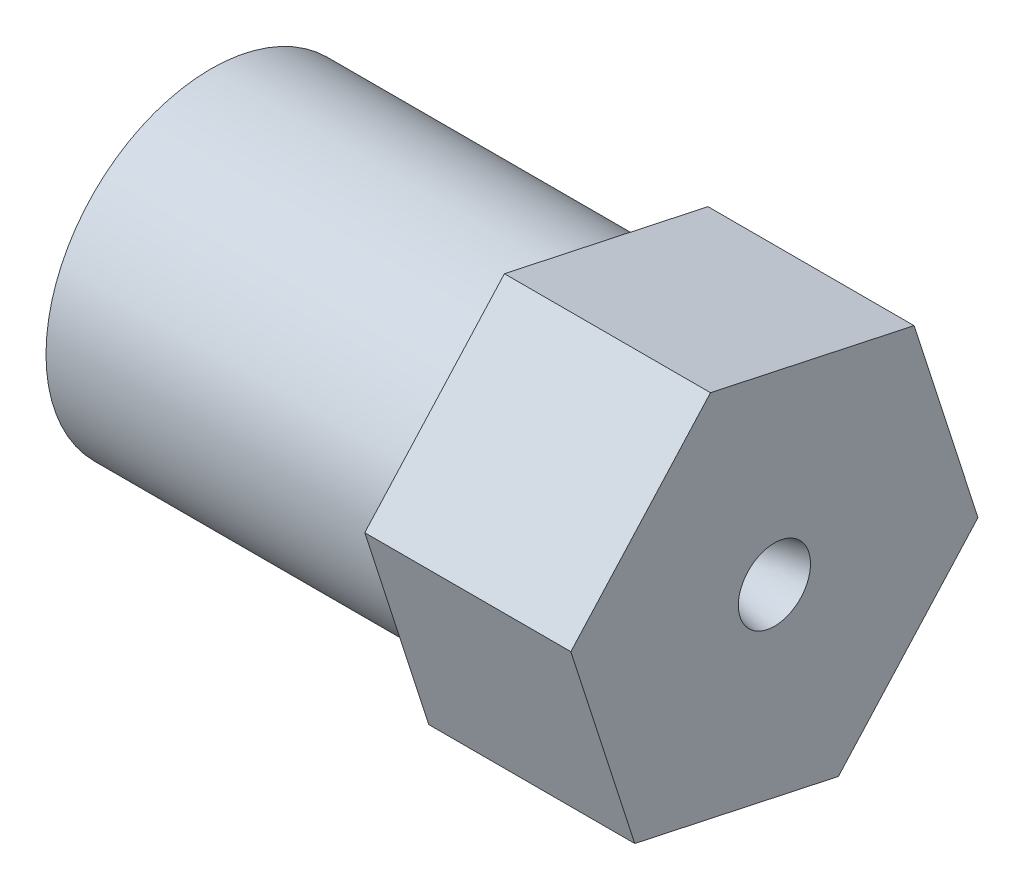
ISO-10303-21;
HEADER;
FILE_DESCRIPTION(('STEP AP214'),'2;1');
FILE_NAME('part.step','',(''),(''),'','','');
FILE_SCHEMA(('AUTOMOTIVE_DESIGN { 1 0 10303 214 1 1 1 1 }'));
ENDSEC;
DATA;
#1=APPLICATION_CONTEXT('core data for automotive mechanical design processes');
#2=APPLICATION_PROTOCOL_DEFINITION('international standard','automotive_design',2000,#1);
#3=PRODUCT_CONTEXT('',#1,'mechanical');
#4=PRODUCT('Part','Part','',(#3));
#5=PRODUCT_RELATED_PRODUCT_CATEGORY('part','',(#4));
#6=PRODUCT_DEFINITION_FORMATION('','',#4);
#7=PRODUCT_DEFINITION_CONTEXT('part definition',#1,'design');
#8=PRODUCT_DEFINITION('design','',#6,#7);
#9=PRODUCT_DEFINITION_SHAPE('','',#8);
#10=(LENGTH_UNIT() NAMED_UNIT(*) SI_UNIT(.MILLI.,.METRE.));
#11=(NAMED_UNIT(*) PLANE_ANGLE_UNIT() SI_UNIT($,.RADIAN.));
#12=(NAMED_UNIT(*) SI_UNIT($,.STERADIAN.) SOLID_ANGLE_UNIT());
#13=UNCERTAINTY_MEASURE_WITH_UNIT(LENGTH_MEASURE(1.E-05),#10,'distance_accuracy_value','');
#14=(GEOMETRIC_REPRESENTATION_CONTEXT(3) GLOBAL_UNCERTAINTY_ASSIGNED_CONTEXT((#13)) GLOBAL_UNIT_ASSIGNED_CONTEXT((#10,
#11,#12)) REPRESENTATION_CONTEXT('',''));
#15=CARTESIAN_POINT('',(0.,0.,0.));
#16=DIRECTION('',(0.,0.,1.));
#17=DIRECTION('',(1.,0.,0.));
#18=AXIS2_PLACEMENT_3D('',#15,#16,#17);
#19=CARTESIAN_POINT('',(0.,0.,0.));
#20=DIRECTION('',(-1.,0.,0.));
#21=DIRECTION('',(0.,0.,1.));
#22=AXIS2_PLACEMENT_3D('',#19,#20,#21);
#23=CYLINDRICAL_SURFACE('',#22,10.16);
#24=CARTESIAN_POINT('',(-10.3539366308657,0.,0.));
#25=DIRECTION('',(1.,0.,0.));
#26=DIRECTION('',(0.,0.,-1.));
#27=AXIS2_PLACEMENT_3D('',#24,#25,#26);
#28=CIRCLE('',#27,10.16);
#29=CARTESIAN_POINT('',(-10.3539366308657,0.,-10.16));
#30=VERTEX_POINT('',#29);
#31=EDGE_CURVE('E11',#30,#30,#28,.F.);
#32=ORIENTED_EDGE('',*,*,#31,.T.);
#33=EDGE_LOOP('',(#32));
#34=FACE_BOUND('',#33,.T.);
#35=CARTESIAN_POINT('',(-31.75,0.,0.));
#36=DIRECTION('',(-1.,0.,0.));
#37=DIRECTION('',(0.,0.,1.));
#38=AXIS2_PLACEMENT_3D('',#35,#36,#37);
#39=CIRCLE('',#38,10.16);
#40=CARTESIAN_POINT('',(-31.75,0.,10.16));
#41=VERTEX_POINT('',#40);
#42=EDGE_CURVE('E225',#41,#41,#39,.T.);
#43=ORIENTED_EDGE('',*,*,#42,.F.);
#44=EDGE_LOOP('',(#43));
#45=FACE_BOUND('',#44,.T.);
#46=ADVANCED_FACE('F37',(#34,#45),#23,.T.);
#47=CARTESIAN_POINT('',(0.,0.,0.));
#48=DIRECTION('',(-1.,0.,0.));
#49=DIRECTION('',(0.,0.,1.));
#50=AXIS2_PLACEMENT_3D('',#47,#48,#49);
#51=TOROIDAL_SURFACE('',#50,3.75,2.25);
#52=CARTESIAN_POINT('',(0.,0.,0.));
#53=DIRECTION('',(-1.,0.,0.));
#54=DIRECTION('',(0.,0.,1.));
#55=AXIS2_PLACEMENT_3D('',#52,#53,#54);
#56=CIRCLE('',#55,1.49999999991984);
#57=CARTESIAN_POINT('',(0.,0.,1.49999999991984));
#58=VERTEX_POINT('',#57);
#59=EDGE_CURVE('E177',#58,#58,#56,.T.);
#60=ORIENTED_EDGE('',*,*,#59,.F.);
#61=EDGE_LOOP('',(#60));
#62=FACE_BOUND('',#61,.T.);
#63=CARTESIAN_POINT('',(-1.59099025766971,0.,0.));
#64=DIRECTION('',(-1.,0.,0.));
#65=DIRECTION('',(0.,0.,1.));
#66=AXIS2_PLACEMENT_3D('',#63,#64,#65);
#67=CIRCLE('',#66,2.15900974233025);
#68=CARTESIAN_POINT('',(-1.59099025766971,0.,2.15900974233025));
#69=VERTEX_POINT('',#68);
#70=EDGE_CURVE('E142',#69,#69,#67,.T.);
#71=ORIENTED_EDGE('',*,*,#70,.T.);
#72=EDGE_LOOP('',(#71));
#73=FACE_BOUND('',#72,.T.);
#74=ADVANCED_FACE('F166',(#62,#73),#51,.T.);
#75=CARTESIAN_POINT('',(0.,0.,0.));
#76=DIRECTION('',(-1.,0.,0.));
#77=DIRECTION('',(0.,0.,1.));
#78=AXIS2_PLACEMENT_3D('',#75,#76,#77);
#79=TOROIDAL_SURFACE('',#78,2.1,0.600000000080161);
#80=CARTESIAN_POINT('',(0.205212085985895,0.,0.));
#81=DIRECTION('',(-1.,0.,0.));
#82=DIRECTION('',(0.,0.,1.));
#83=AXIS2_PLACEMENT_3D('',#80,#81,#82);
#84=CIRCLE('',#83,1.53618442721648);
#85=CARTESIAN_POINT('',(0.205212085985895,0.,1.53618442721648));
#86=VERTEX_POINT('',#85);
#87=EDGE_CURVE('E231',#86,#86,#84,.T.);
#88=ORIENTED_EDGE('',*,*,#87,.F.);
#89=EDGE_LOOP('',(#88));
#90=FACE_BOUND('',#89,.T.);
#91=ORIENTED_EDGE('',*,*,#59,.T.);
#92=EDGE_LOOP('',(#91));
#93=FACE_BOUND('',#92,.T.);
#94=ADVANCED_FACE('F162',(#90,#93),#79,.T.);
#95=CARTESIAN_POINT('',(337159.328455915,-941460.351219445,0.));
#96=CARTESIAN_POINT('',(-342019.938114273,939694.156970084,0.));
#97=CARTESIAN_POINT('',(346881.368620976,-937921.817983014,0.));
#98=B_SPLINE_CURVE_WITH_KNOTS('',2,(#95,#96,#97),.UNSPECIFIED.,.F.,.F.,(3,3),(0.,1.),.UNSPECIFIED.);
#99=CARTESIAN_POINT('',(0.,0.,0.));
#100=DIRECTION('',(-1.,0.,0.));
#101=AXIS1_PLACEMENT('',#99,#100);
#102=SURFACE_OF_REVOLUTION('',#98,#101);
#103=CARTESIAN_POINT('',(2.98106336913434,0.,0.));
#104=DIRECTION('',(-1.,0.,0.));
#105=DIRECTION('',(0.,0.,1.));
#106=AXIS2_PLACEMENT_3D('',#103,#104,#105);
#107=CIRCLE('',#106,2.2248595461287);
#108=CARTESIAN_POINT('',(2.98106336913434,0.,2.2248595461287));
#109=VERTEX_POINT('',#108);
#110=EDGE_CURVE('E228',#109,#109,#107,.T.);
#111=ORIENTED_EDGE('',*,*,#110,.F.);
#112=EDGE_LOOP('',(#111));
#113=FACE_BOUND('',#112,.T.);
#114=ORIENTED_EDGE('',*,*,#87,.T.);
#115=EDGE_LOOP('',(#114));
#116=FACE_BOUND('',#115,.T.);
#117=ADVANCED_FACE('F157',(#113,#116),#102,.T.);
#118=CARTESIAN_POINT('',(2.98106336913434,10.16,0.));
#119=DIRECTION('',(-1.,0.,0.));
#120=DIRECTION('',(0.,0.,1.));
#121=AXIS2_PLACEMENT_3D('',#118,#119,#120);
#122=PLANE('',#121);
#123=ORIENTED_EDGE('',*,*,#110,.T.);
#124=EDGE_LOOP('',(#123));
#125=FACE_BOUND('',#124,.T.);
#126=DIRECTION('',(0.,-0.951681663898051,-0.307086324345838));
#127=VECTOR('',#126,1.);
#128=CARTESIAN_POINT('',(2.98106336913434,-3.41249677929312,10.5755624900671));
#129=LINE('',#128,#127);
#130=CARTESIAN_POINT('',(2.98106336913434,2.69330707117882,12.5457684242007));
#131=VERTEX_POINT('',#130);
#132=CARTESIAN_POINT('',(2.98106336913434,-9.51830062976507,8.60535655593348));
#133=VERTEX_POINT('',#132);
#134=EDGE_CURVE('E125',#131,#133,#129,.T.);
#135=ORIENTED_EDGE('',*,*,#134,.T.);
#136=DIRECTION('',(0.,-0.209896273910742,-0.977723659424475));
#137=VECTOR('',#136,1.);
#138=CARTESIAN_POINT('',(2.98106336913434,-10.8649541653545,2.33247234383312));
#139=LINE('',#138,#137);
#140=CARTESIAN_POINT('',(2.98106336913434,-12.2116077009439,-3.94041186826723));
#141=VERTEX_POINT('',#140);
#142=EDGE_CURVE('E128',#133,#141,#139,.T.);
#143=ORIENTED_EDGE('',*,*,#142,.T.);
#144=DIRECTION('',(0.,0.741785389987309,-0.670637335078637));
#145=VECTOR('',#144,1.);
#146=CARTESIAN_POINT('',(2.98106336913434,-7.45245738606136,-8.24309014623397));
#147=LINE('',#146,#145);
#148=CARTESIAN_POINT('',(2.98106336913434,-2.69330707117882,-12.5457684242007));
#149=VERTEX_POINT('',#148);
#150=EDGE_CURVE('E131',#141,#149,#147,.T.);
#151=ORIENTED_EDGE('',*,*,#150,.T.);
#152=DIRECTION('',(0.,0.951681663898051,0.307086324345838));
#153=VECTOR('',#152,1.);
#154=CARTESIAN_POINT('',(2.98106336913434,3.41249677929312,-10.5755624900671));
#155=LINE('',#154,#153);
#156=CARTESIAN_POINT('',(2.98106336913434,9.51830062976506,-8.60535655593348));
#157=VERTEX_POINT('',#156);
#158=EDGE_CURVE('E134',#149,#157,#155,.T.);
#159=ORIENTED_EDGE('',*,*,#158,.T.);
#160=DIRECTION('',(0.,0.209896273910742,0.977723659424475));
#161=VECTOR('',#160,1.);
#162=CARTESIAN_POINT('',(2.98106336913434,10.8649541653545,-2.33247234383312));
#163=LINE('',#162,#161);
#164=CARTESIAN_POINT('',(2.98106336913434,12.2116077009439,3.94041186826724));
#165=VERTEX_POINT('',#164);
#166=EDGE_CURVE('E102',#157,#165,#163,.T.);
#167=ORIENTED_EDGE('',*,*,#166,.T.);
#168=DIRECTION('',(0.,-0.741785389987309,0.670637335078637));
#169=VECTOR('',#168,1.);
#170=CARTESIAN_POINT('',(2.98106336913434,7.45245738606136,8.24309014623397));
#171=LINE('',#170,#169);
#172=EDGE_CURVE('E137',#165,#131,#171,.T.);
#173=ORIENTED_EDGE('',*,*,#172,.T.);
#174=EDGE_LOOP('',(#135,#143,#151,#159,#167,#173));
#175=FACE_BOUND('',#174,.T.);
#176=ADVANCED_FACE('F161',(#125,#175),#122,.F.);
#177=CARTESIAN_POINT('',(-31.75,10.16,0.));
#178=DIRECTION('',(1.,0.,0.));
#179=DIRECTION('',(0.,0.,-1.));
#180=AXIS2_PLACEMENT_3D('',#177,#178,#179);
#181=PLANE('',#180);
#182=CARTESIAN_POINT('',(-31.75,0.,0.));
#183=DIRECTION('',(-1.,0.,0.));
#184=DIRECTION('',(0.,0.,1.));
#185=AXIS2_PLACEMENT_3D('',#182,#183,#184);
#186=CIRCLE('',#185,8.6614);
#187=CARTESIAN_POINT('',(-31.75,0.,8.6614));
#188=VERTEX_POINT('',#187);
#189=EDGE_CURVE('E222',#188,#188,#186,.T.);
#190=ORIENTED_EDGE('',*,*,#189,.F.);
#191=EDGE_LOOP('',(#190));
#192=FACE_BOUND('',#191,.T.);
#193=ORIENTED_EDGE('',*,*,#42,.T.);
#194=EDGE_LOOP('',(#193));
#195=FACE_BOUND('',#194,.T.);
#196=ADVANCED_FACE('F249',(#192,#195),#181,.F.);
#197=CARTESIAN_POINT('',(-31.115,0.,0.));
#198=DIRECTION('',(-1.,0.,0.));
#199=DIRECTION('',(0.,0.,1.));
#200=AXIS2_PLACEMENT_3D('',#197,#198,#199);
#201=TOROIDAL_SURFACE('',#200,8.6614,0.635);
#202=CARTESIAN_POINT('',(-31.115,0.,0.));
#203=DIRECTION('',(-1.,0.,0.));
#204=DIRECTION('',(0.,0.,1.));
#205=AXIS2_PLACEMENT_3D('',#202,#203,#204);
#206=CIRCLE('',#205,8.02639999999999);
#207=CARTESIAN_POINT('',(-31.115,0.,8.02639999999999));
#208=VERTEX_POINT('',#207);
#209=EDGE_CURVE('E219',#208,#208,#206,.T.);
#210=ORIENTED_EDGE('',*,*,#209,.F.);
#211=EDGE_LOOP('',(#210));
#212=FACE_BOUND('',#211,.T.);
#213=ORIENTED_EDGE('',*,*,#189,.T.);
#214=EDGE_LOOP('',(#213));
#215=FACE_BOUND('',#214,.T.);
#216=ADVANCED_FACE('F251',(#212,#215),#201,.T.);
#217=CARTESIAN_POINT('',(0.,0.,0.));
#218=DIRECTION('',(-1.,0.,0.));
#219=DIRECTION('',(0.,0.,1.));
#220=AXIS2_PLACEMENT_3D('',#217,#218,#219);
#221=CYLINDRICAL_SURFACE('',#220,8.02639999999999);
#222=CARTESIAN_POINT('',(-25.019,0.,0.));
#223=DIRECTION('',(-1.,0.,0.));
#224=DIRECTION('',(0.,0.,1.));
#225=AXIS2_PLACEMENT_3D('',#222,#223,#224);
#226=CIRCLE('',#225,8.02639999999999);
#227=CARTESIAN_POINT('',(-25.019,0.,8.02639999999999));
#228=VERTEX_POINT('',#227);
#229=EDGE_CURVE('E216',#228,#228,#226,.T.);
#230=ORIENTED_EDGE('',*,*,#229,.F.);
#231=EDGE_LOOP('',(#230));
#232=FACE_BOUND('',#231,.T.);
#233=ORIENTED_EDGE('',*,*,#209,.T.);
#234=EDGE_LOOP('',(#233));
#235=FACE_BOUND('',#234,.T.);
#236=ADVANCED_FACE('F258',(#232,#235),#221,.F.);
#237=CARTESIAN_POINT('',(-25.019,0.,0.));
#238=DIRECTION('',(-1.,0.,0.));
#239=DIRECTION('',(0.,0.,1.));
#240=AXIS2_PLACEMENT_3D('',#237,#238,#239);
#241=TOROIDAL_SURFACE('',#240,7.89939999999999,0.127);
#242=CARTESIAN_POINT('',(-24.892,0.,0.));
#243=DIRECTION('',(-1.,0.,0.));
#244=DIRECTION('',(0.,0.,1.));
#245=AXIS2_PLACEMENT_3D('',#242,#243,#244);
#246=CIRCLE('',#245,7.89939999999999);
#247=CARTESIAN_POINT('',(-24.892,0.,7.89939999999999));
#248=VERTEX_POINT('',#247);
#249=EDGE_CURVE('E213',#248,#248,#246,.T.);
#250=ORIENTED_EDGE('',*,*,#249,.F.);
#251=EDGE_LOOP('',(#250));
#252=FACE_BOUND('',#251,.T.);
#253=ORIENTED_EDGE('',*,*,#229,.T.);
#254=EDGE_LOOP('',(#253));
#255=FACE_BOUND('',#254,.T.);
#256=ADVANCED_FACE('F266',(#252,#255),#241,.F.);
#257=CARTESIAN_POINT('',(-24.892,6.9469,0.));
#258=DIRECTION('',(1.,0.,0.));
#259=DIRECTION('',(0.,0.,-1.));
#260=AXIS2_PLACEMENT_3D('',#257,#258,#259);
#261=PLANE('',#260);
#262=CARTESIAN_POINT('',(-24.892,0.,0.));
#263=DIRECTION('',(-1.,0.,0.));
#264=DIRECTION('',(0.,0.,1.));
#265=AXIS2_PLACEMENT_3D('',#262,#263,#264);
#266=CIRCLE('',#265,6.9469);
#267=CARTESIAN_POINT('',(-24.892,0.,6.9469));
#268=VERTEX_POINT('',#267);
#269=EDGE_CURVE('E210',#268,#268,#266,.T.);
#270=ORIENTED_EDGE('',*,*,#269,.F.);
#271=EDGE_LOOP('',(#270));
#272=FACE_BOUND('',#271,.T.);
#273=ORIENTED_EDGE('',*,*,#249,.T.);
#274=EDGE_LOOP('',(#273));
#275=FACE_BOUND('',#274,.T.);
#276=ADVANCED_FACE('F270',(#272,#275),#261,.F.);
#277=CARTESIAN_POINT('',(0.,0.,0.));
#278=DIRECTION('',(-1.,0.,0.));
#279=DIRECTION('',(0.,0.,1.));
#280=AXIS2_PLACEMENT_3D('',#277,#278,#279);
#281=CYLINDRICAL_SURFACE('',#280,6.9469);
#282=CARTESIAN_POINT('',(-20.066,0.,0.));
#283=DIRECTION('',(-1.,0.,0.));
#284=DIRECTION('',(0.,0.,1.));
#285=AXIS2_PLACEMENT_3D('',#282,#283,#284);
#286=CIRCLE('',#285,6.9469);
#287=CARTESIAN_POINT('',(-20.066,0.,6.9469));
#288=VERTEX_POINT('',#287);
#289=EDGE_CURVE('E207',#288,#288,#286,.T.);
#290=ORIENTED_EDGE('',*,*,#289,.F.);
#291=EDGE_LOOP('',(#290));
#292=FACE_BOUND('',#291,.T.);
#293=ORIENTED_EDGE('',*,*,#269,.T.);
#294=EDGE_LOOP('',(#293));
#295=FACE_BOUND('',#294,.T.);
#296=ADVANCED_FACE('F274',(#292,#295),#281,.F.);
#297=CARTESIAN_POINT('',(-20.066,0.,0.));
#298=DIRECTION('',(-1.,0.,0.));
#299=DIRECTION('',(0.,0.,1.));
#300=AXIS2_PLACEMENT_3D('',#297,#298,#299);
#301=TOROIDAL_SURFACE('',#300,6.8199,0.127);
#302=CARTESIAN_POINT('',(-19.939,0.,0.));
#303=DIRECTION('',(-1.,0.,0.));
#304=DIRECTION('',(0.,0.,1.));
#305=AXIS2_PLACEMENT_3D('',#302,#303,#304);
#306=CIRCLE('',#305,6.8199);
#307=CARTESIAN_POINT('',(-19.939,0.,6.8199));
#308=VERTEX_POINT('',#307);
#309=EDGE_CURVE('E204',#308,#308,#306,.T.);
#310=ORIENTED_EDGE('',*,*,#309,.F.);
#311=EDGE_LOOP('',(#310));
#312=FACE_BOUND('',#311,.T.);
#313=ORIENTED_EDGE('',*,*,#289,.T.);
#314=EDGE_LOOP('',(#313));
#315=FACE_BOUND('',#314,.T.);
#316=ADVANCED_FACE('F278',(#312,#315),#301,.F.);
#317=CARTESIAN_POINT('',(-19.939,5.46100000000001,0.));
#318=DIRECTION('',(1.,0.,0.));
#319=DIRECTION('',(0.,0.,-1.));
#320=AXIS2_PLACEMENT_3D('',#317,#318,#319);
#321=PLANE('',#320);
#322=CARTESIAN_POINT('',(-19.939,0.,0.));
#323=DIRECTION('',(-1.,0.,0.));
#324=DIRECTION('',(0.,0.,1.));
#325=AXIS2_PLACEMENT_3D('',#322,#323,#324);
#326=CIRCLE('',#325,5.46100000000001);
#327=CARTESIAN_POINT('',(-19.939,0.,5.46100000000001));
#328=VERTEX_POINT('',#327);
#329=EDGE_CURVE('E201',#328,#328,#326,.T.);
#330=ORIENTED_EDGE('',*,*,#329,.F.);
#331=EDGE_LOOP('',(#330));
#332=FACE_BOUND('',#331,.T.);
#333=ORIENTED_EDGE('',*,*,#309,.T.);
#334=EDGE_LOOP('',(#333));
#335=FACE_BOUND('',#334,.T.);
#336=ADVANCED_FACE('F282',(#332,#335),#321,.F.);
#337=CARTESIAN_POINT('',(-19.304,0.,0.));
#338=DIRECTION('',(-1.,0.,0.));
#339=DIRECTION('',(0.,0.,1.));
#340=AXIS2_PLACEMENT_3D('',#337,#338,#339);
#341=TOROIDAL_SURFACE('',#340,5.461,0.635);
#342=CARTESIAN_POINT('',(-19.304,0.,0.));
#343=DIRECTION('',(-1.,0.,0.));
#344=DIRECTION('',(0.,0.,1.));
#345=AXIS2_PLACEMENT_3D('',#342,#343,#344);
#346=CIRCLE('',#345,4.826);
#347=CARTESIAN_POINT('',(-19.304,0.,4.826));
#348=VERTEX_POINT('',#347);
#349=EDGE_CURVE('E198',#348,#348,#346,.T.);
#350=ORIENTED_EDGE('',*,*,#349,.F.);
#351=EDGE_LOOP('',(#350));
#352=FACE_BOUND('',#351,.T.);
#353=ORIENTED_EDGE('',*,*,#329,.T.);
#354=EDGE_LOOP('',(#353));
#355=FACE_BOUND('',#354,.T.);
#356=ADVANCED_FACE('F286',(#352,#355),#341,.T.);
#357=CARTESIAN_POINT('',(0.,0.,0.));
#358=DIRECTION('',(-1.,0.,0.));
#359=DIRECTION('',(0.,0.,1.));
#360=AXIS2_PLACEMENT_3D('',#357,#358,#359);
#361=CYLINDRICAL_SURFACE('',#360,4.826);
#362=CARTESIAN_POINT('',(-13.589,0.,0.));
#363=DIRECTION('',(-1.,0.,0.));
#364=DIRECTION('',(0.,0.,1.));
#365=AXIS2_PLACEMENT_3D('',#362,#363,#364);
#366=CIRCLE('',#365,4.826);
#367=CARTESIAN_POINT('',(-13.589,0.,4.826));
#368=VERTEX_POINT('',#367);
#369=EDGE_CURVE('E195',#368,#368,#366,.T.);
#370=ORIENTED_EDGE('',*,*,#369,.F.);
#371=EDGE_LOOP('',(#370));
#372=FACE_BOUND('',#371,.T.);
#373=ORIENTED_EDGE('',*,*,#349,.T.);
#374=EDGE_LOOP('',(#373));
#375=FACE_BOUND('',#374,.T.);
#376=ADVANCED_FACE('F290',(#372,#375),#361,.F.);
#377=CARTESIAN_POINT('',(-13.589,0.,0.));
#378=DIRECTION('',(-1.,0.,0.));
#379=DIRECTION('',(0.,0.,1.));
#380=AXIS2_PLACEMENT_3D('',#377,#378,#379);
#381=TOROIDAL_SURFACE('',#380,4.699,0.127);
#382=CARTESIAN_POINT('',(-13.462,0.,0.));
#383=DIRECTION('',(-1.,0.,0.));
#384=DIRECTION('',(0.,0.,1.));
#385=AXIS2_PLACEMENT_3D('',#382,#383,#384);
#386=CIRCLE('',#385,4.699);
#387=CARTESIAN_POINT('',(-13.462,0.,4.699));
#388=VERTEX_POINT('',#387);
#389=EDGE_CURVE('E192',#388,#388,#386,.T.);
#390=ORIENTED_EDGE('',*,*,#389,.F.);
#391=EDGE_LOOP('',(#390));
#392=FACE_BOUND('',#391,.T.);
#393=ORIENTED_EDGE('',*,*,#369,.T.);
#394=EDGE_LOOP('',(#393));
#395=FACE_BOUND('',#394,.T.);
#396=ADVANCED_FACE('F294',(#392,#395),#381,.F.);
#397=CARTESIAN_POINT('',(-13.462,4.445,0.));
#398=DIRECTION('',(1.,0.,0.));
#399=DIRECTION('',(0.,0.,-1.));
#400=AXIS2_PLACEMENT_3D('',#397,#398,#399);
#401=PLANE('',#400);
#402=CARTESIAN_POINT('',(-13.462,0.,0.));
#403=DIRECTION('',(-1.,0.,0.));
#404=DIRECTION('',(0.,0.,1.));
#405=AXIS2_PLACEMENT_3D('',#402,#403,#404);
#406=CIRCLE('',#405,4.445);
#407=CARTESIAN_POINT('',(-13.462,0.,4.445));
#408=VERTEX_POINT('',#407);
#409=EDGE_CURVE('E187',#408,#408,#406,.T.);
#410=ORIENTED_EDGE('',*,*,#409,.F.);
#411=EDGE_LOOP('',(#410));
#412=FACE_BOUND('',#411,.T.);
#413=ORIENTED_EDGE('',*,*,#389,.T.);
#414=EDGE_LOOP('',(#413));
#415=FACE_BOUND('',#414,.T.);
#416=ADVANCED_FACE('F298',(#412,#415),#401,.F.);
#417=CARTESIAN_POINT('',(0.,0.,0.));
#418=DIRECTION('',(-1.,0.,0.));
#419=DIRECTION('',(0.,0.,1.));
#420=AXIS2_PLACEMENT_3D('',#417,#418,#419);
#421=CYLINDRICAL_SURFACE('',#420,4.445);
#422=CARTESIAN_POINT('',(-5.19210857587407,0.,0.));
#423=DIRECTION('',(-1.,0.,0.));
#424=DIRECTION('',(0.,0.,1.));
#425=AXIS2_PLACEMENT_3D('',#422,#423,#424);
#426=CIRCLE('',#425,4.445);
#427=CARTESIAN_POINT('',(-5.19210857587407,0.,4.445));
#428=VERTEX_POINT('',#427);
#429=EDGE_CURVE('E183',#428,#428,#426,.T.);
#430=ORIENTED_EDGE('',*,*,#429,.F.);
#431=EDGE_LOOP('',(#430));
#432=FACE_BOUND('',#431,.T.);
#433=ORIENTED_EDGE('',*,*,#409,.T.);
#434=EDGE_LOOP('',(#433));
#435=FACE_BOUND('',#434,.T.);
#436=ADVANCED_FACE('F302',(#432,#435),#421,.F.);
#437=CARTESIAN_POINT('',(-5.19210857587407,0.,0.));
#438=DIRECTION('',(-1.,0.,0.));
#439=DIRECTION('',(0.,0.,1.));
#440=AXIS2_PLACEMENT_3D('',#437,#438,#439);
#441=DEGENERATE_TOROIDAL_SURFACE('',#440,1.27,3.175,.T.);
#442=CARTESIAN_POINT('',(-2.94704454560681,0.,0.));
#443=DIRECTION('',(-1.,0.,0.));
#444=DIRECTION('',(0.,0.,1.));
#445=AXIS2_PLACEMENT_3D('',#442,#443,#444);
#446=CIRCLE('',#445,3.51506403026731);
#447=CARTESIAN_POINT('',(-2.94704454560681,0.,3.51506403026731));
#448=VERTEX_POINT('',#447);
#449=EDGE_CURVE('E181',#448,#448,#446,.T.);
#450=ORIENTED_EDGE('',*,*,#449,.F.);
#451=EDGE_LOOP('',(#450));
#452=FACE_BOUND('',#451,.T.);
#453=ORIENTED_EDGE('',*,*,#429,.T.);
#454=EDGE_LOOP('',(#453));
#455=FACE_BOUND('',#454,.T.);
#456=ADVANCED_FACE('F306',(#452,#455),#441,.F.);
#457=CARTESIAN_POINT('',(-2.94704454560681,0.,0.));
#458=DIRECTION('',(-1.,0.,0.));
#459=DIRECTION('',(0.,0.,1.));
#460=AXIS2_PLACEMENT_3D('',#457,#458,#459);
#461=CONICAL_SURFACE('',#460,3.51506403026731,0.785398163397437);
#462=ORIENTED_EDGE('',*,*,#70,.F.);
#463=EDGE_LOOP('',(#462));
#464=FACE_BOUND('',#463,.T.);
#465=ORIENTED_EDGE('',*,*,#449,.T.);
#466=EDGE_LOOP('',(#465));
#467=FACE_BOUND('',#466,.T.);
#468=ADVANCED_FACE('F310',(#464,#467),#461,.F.);
#469=CARTESIAN_POINT('',(-9.71893663086566,-3.41249677929312,10.5755624900671));
#470=DIRECTION('',(0.,-0.307086324345838,0.951681663898051));
#471=DIRECTION('',(0.,-0.951681663898051,-0.307086324345838));
#472=AXIS2_PLACEMENT_3D('',#469,#470,#471);
#473=PLANE('',#472);
#474=ORIENTED_EDGE('',*,*,#134,.F.);
#475=DIRECTION('',(1.,0.,0.));
#476=VECTOR('',#475,1.);
#477=CARTESIAN_POINT('',(-9.71893663086566,2.69330707117882,12.5457684242007));
#478=LINE('',#477,#476);
#479=CARTESIAN_POINT('',(-9.71893663086566,2.69330707117882,12.5457684242007));
#480=VERTEX_POINT('',#479);
#481=EDGE_CURVE('E54',#480,#131,#478,.T.);
#482=ORIENTED_EDGE('',*,*,#481,.F.);
#483=DIRECTION('',(0.,-0.951681663898051,-0.307086324345838));
#484=VECTOR('',#483,1.);
#485=CARTESIAN_POINT('',(-9.71893663086566,-3.41249677929312,10.5755624900671));
#486=LINE('',#485,#484);
#487=CARTESIAN_POINT('',(-9.71893663086566,-9.51830062976507,8.60535655593348));
#488=VERTEX_POINT('',#487);
#489=EDGE_CURVE('E140',#480,#488,#486,.T.);
#490=ORIENTED_EDGE('',*,*,#489,.T.);
#491=DIRECTION('',(1.,0.,0.));
#492=VECTOR('',#491,1.);
#493=CARTESIAN_POINT('',(-9.71893663086566,-9.51830062976507,8.60535655593348));
#494=LINE('',#493,#492);
#495=EDGE_CURVE('E89',#488,#133,#494,.T.);
#496=ORIENTED_EDGE('',*,*,#495,.T.);
#497=EDGE_LOOP('',(#474,#482,#490,#496));
#498=FACE_BOUND('',#497,.T.);
#499=ADVANCED_FACE('F314',(#498),#473,.T.);
#500=CARTESIAN_POINT('',(-9.71893663086566,7.45245738606136,8.24309014623397));
#501=DIRECTION('',(0.,0.670637335078637,0.741785389987309));
#502=DIRECTION('',(0.,-0.741785389987309,0.670637335078637));
#503=AXIS2_PLACEMENT_3D('',#500,#501,#502);
#504=PLANE('',#503);
#505=ORIENTED_EDGE('',*,*,#172,.F.);
#506=DIRECTION('',(1.,0.,0.));
#507=VECTOR('',#506,1.);
#508=CARTESIAN_POINT('',(-9.71893663086566,12.2116077009439,3.94041186826724));
#509=LINE('',#508,#507);
#510=CARTESIAN_POINT('',(-9.71893663086566,12.2116077009439,3.94041186826724));
#511=VERTEX_POINT('',#510);
#512=EDGE_CURVE('E77',#511,#165,#509,.T.);
#513=ORIENTED_EDGE('',*,*,#512,.F.);
#514=DIRECTION('',(0.,-0.741785389987309,0.670637335078637));
#515=VECTOR('',#514,1.);
#516=CARTESIAN_POINT('',(-9.71893663086566,7.45245738606136,8.24309014623397));
#517=LINE('',#516,#515);
#518=EDGE_CURVE('E115',#511,#480,#517,.T.);
#519=ORIENTED_EDGE('',*,*,#518,.T.);
#520=ORIENTED_EDGE('',*,*,#481,.T.);
#521=EDGE_LOOP('',(#505,#513,#519,#520));
#522=FACE_BOUND('',#521,.T.);
#523=ADVANCED_FACE('F317',(#522),#504,.T.);
#524=CARTESIAN_POINT('',(-9.71893663086566,10.8649541653545,-2.33247234383312));
#525=DIRECTION('',(0.,0.977723659424475,-0.209896273910742));
#526=DIRECTION('',(0.,0.209896273910742,0.977723659424475));
#527=AXIS2_PLACEMENT_3D('',#524,#525,#526);
#528=PLANE('',#527);
#529=ORIENTED_EDGE('',*,*,#166,.F.);
#530=DIRECTION('',(1.,0.,0.));
#531=VECTOR('',#530,1.);
#532=CARTESIAN_POINT('',(-9.71893663086566,9.51830062976506,-8.60535655593348));
#533=LINE('',#532,#531);
#534=CARTESIAN_POINT('',(-9.71893663086566,9.51830062976506,-8.60535655593348));
#535=VERTEX_POINT('',#534);
#536=EDGE_CURVE('E97',#535,#157,#533,.T.);
#537=ORIENTED_EDGE('',*,*,#536,.F.);
#538=DIRECTION('',(0.,0.209896273910742,0.977723659424475));
#539=VECTOR('',#538,1.);
#540=CARTESIAN_POINT('',(-9.71893663086566,10.8649541653545,-2.33247234383312));
#541=LINE('',#540,#539);
#542=EDGE_CURVE('E100',#535,#511,#541,.T.);
#543=ORIENTED_EDGE('',*,*,#542,.T.);
#544=ORIENTED_EDGE('',*,*,#512,.T.);
#545=EDGE_LOOP('',(#529,#537,#543,#544));
#546=FACE_BOUND('',#545,.T.);
#547=ADVANCED_FACE('F99',(#546),#528,.T.);
#548=CARTESIAN_POINT('',(-9.71893663086566,3.41249677929312,-10.5755624900671));
#549=DIRECTION('',(0.,0.307086324345838,-0.951681663898051));
#550=DIRECTION('',(0.,0.951681663898051,0.307086324345838));
#551=AXIS2_PLACEMENT_3D('',#548,#549,#550);
#552=PLANE('',#551);
#553=ORIENTED_EDGE('',*,*,#158,.F.);
#554=DIRECTION('',(1.,0.,0.));
#555=VECTOR('',#554,1.);
#556=CARTESIAN_POINT('',(-9.71893663086566,-2.69330707117882,-12.5457684242007));
#557=LINE('',#556,#555);
#558=CARTESIAN_POINT('',(-9.71893663086566,-2.69330707117882,-12.5457684242007));
#559=VERTEX_POINT('',#558);
#560=EDGE_CURVE('E107',#559,#149,#557,.T.);
#561=ORIENTED_EDGE('',*,*,#560,.F.);
#562=DIRECTION('',(0.,0.951681663898051,0.307086324345838));
#563=VECTOR('',#562,1.);
#564=CARTESIAN_POINT('',(-9.71893663086566,3.41249677929312,-10.5755624900671));
#565=LINE('',#564,#563);
#566=EDGE_CURVE('E113',#559,#535,#565,.T.);
#567=ORIENTED_EDGE('',*,*,#566,.T.);
#568=ORIENTED_EDGE('',*,*,#536,.T.);
#569=EDGE_LOOP('',(#553,#561,#567,#568));
#570=FACE_BOUND('',#569,.T.);
#571=ADVANCED_FACE('F117',(#570),#552,.T.);
#572=CARTESIAN_POINT('',(-9.71893663086566,-7.45245738606136,-8.24309014623397));
#573=DIRECTION('',(0.,-0.670637335078637,-0.741785389987309));
#574=DIRECTION('',(0.,0.741785389987309,-0.670637335078637));
#575=AXIS2_PLACEMENT_3D('',#572,#573,#574);
#576=PLANE('',#575);
#577=ORIENTED_EDGE('',*,*,#150,.F.);
#578=DIRECTION('',(1.,0.,0.));
#579=VECTOR('',#578,1.);
#580=CARTESIAN_POINT('',(-9.71893663086566,-12.2116077009439,-3.94041186826723));
#581=LINE('',#580,#579);
#582=CARTESIAN_POINT('',(-9.71893663086566,-12.2116077009439,-3.94041186826723));
#583=VERTEX_POINT('',#582);
#584=EDGE_CURVE('E145',#583,#141,#581,.T.);
#585=ORIENTED_EDGE('',*,*,#584,.F.);
#586=DIRECTION('',(0.,0.741785389987309,-0.670637335078637));
#587=VECTOR('',#586,1.);
#588=CARTESIAN_POINT('',(-9.71893663086566,-7.45245738606136,-8.24309014623397));
#589=LINE('',#588,#587);
#590=EDGE_CURVE('E118',#583,#559,#589,.T.);
#591=ORIENTED_EDGE('',*,*,#590,.T.);
#592=ORIENTED_EDGE('',*,*,#560,.T.);
#593=EDGE_LOOP('',(#577,#585,#591,#592));
#594=FACE_BOUND('',#593,.T.);
#595=ADVANCED_FACE('F320',(#594),#576,.T.);
#596=CARTESIAN_POINT('',(-9.71893663086566,-10.8649541653545,2.33247234383312));
#597=DIRECTION('',(0.,-0.977723659424475,0.209896273910742));
#598=DIRECTION('',(0.,-0.209896273910742,-0.977723659424475));
#599=AXIS2_PLACEMENT_3D('',#596,#597,#598);
#600=PLANE('',#599);
#601=ORIENTED_EDGE('',*,*,#142,.F.);
#602=ORIENTED_EDGE('',*,*,#495,.F.);
#603=DIRECTION('',(0.,-0.209896273910742,-0.977723659424475));
#604=VECTOR('',#603,1.);
#605=CARTESIAN_POINT('',(-9.71893663086566,-10.8649541653545,2.33247234383312));
#606=LINE('',#605,#604);
#607=EDGE_CURVE('E120',#488,#583,#606,.T.);
#608=ORIENTED_EDGE('',*,*,#607,.T.);
#609=ORIENTED_EDGE('',*,*,#584,.T.);
#610=EDGE_LOOP('',(#601,#602,#608,#609));
#611=FACE_BOUND('',#610,.T.);
#612=ADVANCED_FACE('F243',(#611),#600,.T.);
#613=CARTESIAN_POINT('',(-9.71893663086566,0.,0.));
#614=DIRECTION('',(1.,0.,0.));
#615=DIRECTION('',(0.,0.,-1.));
#616=AXIS2_PLACEMENT_3D('',#613,#614,#615);
#617=PLANE('',#616);
#618=CARTESIAN_POINT('',(-9.71893663086566,0.,0.));
#619=DIRECTION('',(1.,0.,0.));
#620=DIRECTION('',(0.,0.,-1.));
#621=AXIS2_PLACEMENT_3D('',#618,#619,#620);
#622=CIRCLE('',#621,10.795);
#623=CARTESIAN_POINT('',(-9.71893663086566,0.,-10.795));
#624=VERTEX_POINT('',#623);
#625=EDGE_CURVE('E46',#624,#624,#622,.T.);
#626=ORIENTED_EDGE('',*,*,#625,.T.);
#627=EDGE_LOOP('',(#626));
#628=FACE_BOUND('',#627,.T.);
#629=ORIENTED_EDGE('',*,*,#489,.F.);
#630=ORIENTED_EDGE('',*,*,#518,.F.);
#631=ORIENTED_EDGE('',*,*,#542,.F.);
#632=ORIENTED_EDGE('',*,*,#566,.F.);
#633=ORIENTED_EDGE('',*,*,#590,.F.);
#634=ORIENTED_EDGE('',*,*,#607,.F.);
#635=EDGE_LOOP('',(#629,#630,#631,#632,#633,#634));
#636=FACE_BOUND('',#635,.T.);
#637=ADVANCED_FACE('F111',(#628,#636),#617,.F.);
#638=CARTESIAN_POINT('',(-10.3539366308657,0.,0.));
#639=DIRECTION('',(1.,0.,0.));
#640=DIRECTION('',(0.,0.,-1.));
#641=AXIS2_PLACEMENT_3D('',#638,#639,#640);
#642=TOROIDAL_SURFACE('',#641,10.795,0.635);
#643=ORIENTED_EDGE('',*,*,#31,.F.);
#644=EDGE_LOOP('',(#643));
#645=FACE_BOUND('',#644,.T.);
#646=ORIENTED_EDGE('',*,*,#625,.F.);
#647=EDGE_LOOP('',(#646));
#648=FACE_BOUND('',#647,.T.);
#649=ADVANCED_FACE('F39',(#645,#648),#642,.F.);
#650=CLOSED_SHELL('',(#46,#74,#94,#117,#176,#196,#216,#236,#256,#276,#296,#316,#336,#356,#376,
#396,#416,#436,#456,#468,#499,#523,#547,#571,#595,#612,#637,#649));
#651=MANIFOLD_SOLID_BREP('B2',#650);
#652=ADVANCED_BREP_SHAPE_REPRESENTATION('',(#18,#651),#14);
#653=SHAPE_DEFINITION_REPRESENTATION(#9,#652);
ENDSEC;
END-ISO-10303-21;
